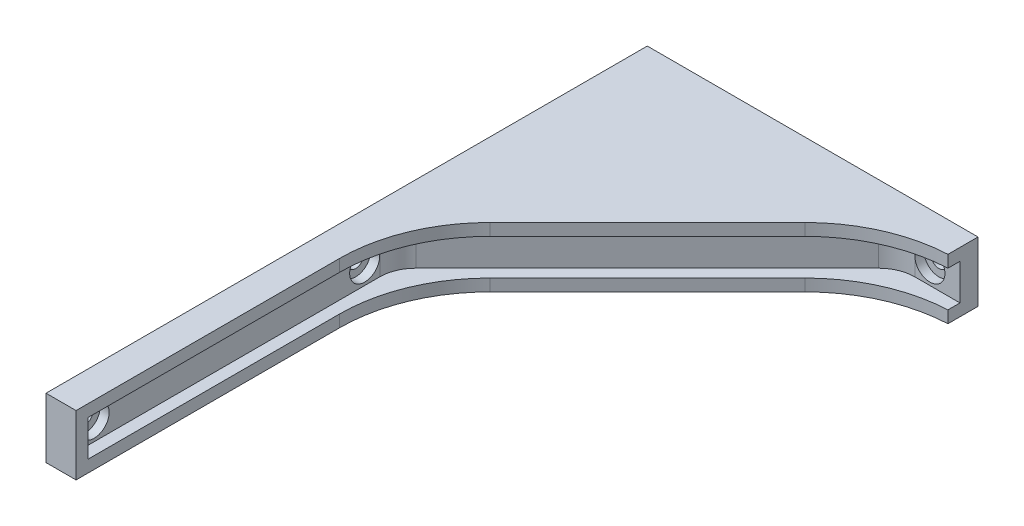
ISO-10303-21;
HEADER;
FILE_DESCRIPTION(('STEP AP214'),'2;1');
FILE_NAME('part.step','',(''),(''),'','','');
FILE_SCHEMA(('AUTOMOTIVE_DESIGN { 1 0 10303 214 1 1 1 1 }'));
ENDSEC;
DATA;
#1=APPLICATION_CONTEXT('core data for automotive mechanical design processes');
#2=APPLICATION_PROTOCOL_DEFINITION('international standard','automotive_design',2000,#1);
#3=PRODUCT_CONTEXT('',#1,'mechanical');
#4=PRODUCT('Part','Part','',(#3));
#5=PRODUCT_RELATED_PRODUCT_CATEGORY('part','',(#4));
#6=PRODUCT_DEFINITION_FORMATION('','',#4);
#7=PRODUCT_DEFINITION_CONTEXT('part definition',#1,'design');
#8=PRODUCT_DEFINITION('design','',#6,#7);
#9=PRODUCT_DEFINITION_SHAPE('','',#8);
#10=(LENGTH_UNIT() NAMED_UNIT(*) SI_UNIT(.MILLI.,.METRE.));
#11=(NAMED_UNIT(*) PLANE_ANGLE_UNIT() SI_UNIT($,.RADIAN.));
#12=(NAMED_UNIT(*) SI_UNIT($,.STERADIAN.) SOLID_ANGLE_UNIT());
#13=UNCERTAINTY_MEASURE_WITH_UNIT(LENGTH_MEASURE(1.E-05),#10,'distance_accuracy_value','');
#14=(GEOMETRIC_REPRESENTATION_CONTEXT(3) GLOBAL_UNCERTAINTY_ASSIGNED_CONTEXT((#13)) GLOBAL_UNIT_ASSIGNED_CONTEXT((#10,
#11,#12)) REPRESENTATION_CONTEXT('',''));
#15=CARTESIAN_POINT('',(0.,0.,0.));
#16=DIRECTION('',(0.,0.,1.));
#17=DIRECTION('',(1.,0.,0.));
#18=AXIS2_PLACEMENT_3D('',#15,#16,#17);
#19=CARTESIAN_POINT('',(6.00000000000001,20.,110.));
#20=DIRECTION('',(-1.,0.,0.));
#21=DIRECTION('',(0.,0.,1.));
#22=AXIS2_PLACEMENT_3D('',#19,#20,#21);
#23=PLANE('',#22);
#24=CARTESIAN_POINT('',(6.00000000000001,10.,100.));
#25=DIRECTION('',(1.,0.,0.));
#26=DIRECTION('',(0.,0.,-1.));
#27=AXIS2_PLACEMENT_3D('',#24,#25,#26);
#28=CIRCLE('',#27,5.);
#29=CARTESIAN_POINT('',(6.00000000000001,10.,95.));
#30=VERTEX_POINT('',#29);
#31=EDGE_CURVE('E280',#30,#30,#28,.T.);
#32=ORIENTED_EDGE('',*,*,#31,.F.);
#33=EDGE_LOOP('',(#32));
#34=FACE_BOUND('',#33,.T.);
#35=CARTESIAN_POINT('',(6.00000000000001,10.,190.));
#36=DIRECTION('',(1.,0.,0.));
#37=DIRECTION('',(0.,0.,-1.));
#38=AXIS2_PLACEMENT_3D('',#35,#36,#37);
#39=CIRCLE('',#38,4.99999999999999);
#40=CARTESIAN_POINT('',(6.00000000000001,10.,185.));
#41=VERTEX_POINT('',#40);
#42=EDGE_CURVE('E244',#41,#41,#39,.T.);
#43=ORIENTED_EDGE('',*,*,#42,.F.);
#44=EDGE_LOOP('',(#43));
#45=FACE_BOUND('',#44,.T.);
#46=DIRECTION('',(0.,1.,0.));
#47=VECTOR('',#46,1.);
#48=CARTESIAN_POINT('',(6.00000000000001,16.,196.));
#49=LINE('',#48,#47);
#50=CARTESIAN_POINT('',(6.00000000000001,4.,196.));
#51=VERTEX_POINT('',#50);
#52=CARTESIAN_POINT('',(6.00000000000001,16.,196.));
#53=VERTEX_POINT('',#52);
#54=EDGE_CURVE('E177',#51,#53,#49,.T.);
#55=ORIENTED_EDGE('',*,*,#54,.F.);
#56=DIRECTION('',(0.,0.,1.));
#57=VECTOR('',#56,1.);
#58=CARTESIAN_POINT('',(6.00000000000001,4.,200.));
#59=LINE('',#58,#57);
#60=CARTESIAN_POINT('',(6.00000000000001,4.,94.9705627484771));
#61=VERTEX_POINT('',#60);
#62=EDGE_CURVE('E185',#61,#51,#59,.T.);
#63=ORIENTED_EDGE('',*,*,#62,.F.);
#64=DIRECTION('',(0.,-1.,0.));
#65=VECTOR('',#64,1.);
#66=CARTESIAN_POINT('',(6.00000000000001,16.,94.9705627484771));
#67=LINE('',#66,#65);
#68=CARTESIAN_POINT('',(6.00000000000001,16.,94.9705627484771));
#69=VERTEX_POINT('',#68);
#70=EDGE_CURVE('E352',#61,#69,#67,.F.);
#71=ORIENTED_EDGE('',*,*,#70,.T.);
#72=DIRECTION('',(0.,0.,-1.));
#73=VECTOR('',#72,1.);
#74=CARTESIAN_POINT('',(6.00000000000001,16.,200.));
#75=LINE('',#74,#73);
#76=EDGE_CURVE('E195',#53,#69,#75,.T.);
#77=ORIENTED_EDGE('',*,*,#76,.F.);
#78=EDGE_LOOP('',(#55,#63,#71,#77));
#79=FACE_BOUND('',#78,.T.);
#80=ADVANCED_FACE('F39',(#34,#45,#79),#23,.F.);
#81=CARTESIAN_POINT('',(92.8284271247462,16.,8.82842712474619));
#82=DIRECTION('',(0.,1.,0.));
#83=DIRECTION('',(0.,0.,1.));
#84=AXIS2_PLACEMENT_3D('',#81,#82,#83);
#85=PLANE('',#84);
#86=DIRECTION('',(-1.,0.,0.));
#87=VECTOR('',#86,1.);
#88=CARTESIAN_POINT('',(10.,16.,196.));
#89=LINE('',#88,#87);
#90=CARTESIAN_POINT('',(10.,16.,196.));
#91=VERTEX_POINT('',#90);
#92=EDGE_CURVE('E174',#91,#53,#89,.T.);
#93=ORIENTED_EDGE('',*,*,#92,.T.);
#94=ORIENTED_EDGE('',*,*,#76,.T.);
#95=CARTESIAN_POINT('',(18.,16.,94.9705627484771));
#96=DIRECTION('',(0.,1.,0.));
#97=DIRECTION('',(0.,0.,1.));
#98=AXIS2_PLACEMENT_3D('',#95,#96,#97);
#99=CIRCLE('',#98,12.);
#100=CARTESIAN_POINT('',(9.51471862576146,16.,86.4852813742386));
#101=VERTEX_POINT('',#100);
#102=EDGE_CURVE('E346',#69,#101,#99,.F.);
#103=ORIENTED_EDGE('',*,*,#102,.T.);
#104=DIRECTION('',(0.707106781186547,0.,-0.707106781186548));
#105=VECTOR('',#104,1.);
#106=CARTESIAN_POINT('',(90.,16.,6.));
#107=LINE('',#106,#105);
#108=CARTESIAN_POINT('',(86.4852813742386,16.,9.51471862576143));
#109=VERTEX_POINT('',#108);
#110=EDGE_CURVE('E224',#101,#109,#107,.T.);
#111=ORIENTED_EDGE('',*,*,#110,.T.);
#112=CARTESIAN_POINT('',(94.9705627484771,16.,18.));
#113=DIRECTION('',(0.,1.,0.));
#114=DIRECTION('',(0.,0.,1.));
#115=AXIS2_PLACEMENT_3D('',#112,#113,#114);
#116=CIRCLE('',#115,12.);
#117=CARTESIAN_POINT('',(94.9705627484771,16.,6.00000000000001));
#118=VERTEX_POINT('',#117);
#119=EDGE_CURVE('E349',#109,#118,#116,.F.);
#120=ORIENTED_EDGE('',*,*,#119,.T.);
#121=DIRECTION('',(1.,0.,0.));
#122=VECTOR('',#121,1.);
#123=CARTESIAN_POINT('',(90.,16.,6.00000000000001));
#124=LINE('',#123,#122);
#125=CARTESIAN_POINT('',(110.,16.,6.));
#126=VERTEX_POINT('',#125);
#127=EDGE_CURVE('E452',#118,#126,#124,.T.);
#128=ORIENTED_EDGE('',*,*,#127,.T.);
#129=DIRECTION('',(0.,0.,-1.));
#130=VECTOR('',#129,1.);
#131=CARTESIAN_POINT('',(110.,16.,10.));
#132=LINE('',#131,#130);
#133=CARTESIAN_POINT('',(110.,16.,10.));
#134=VERTEX_POINT('',#133);
#135=EDGE_CURVE('E207',#134,#126,#132,.T.);
#136=ORIENTED_EDGE('',*,*,#135,.F.);
#137=CARTESIAN_POINT('',(112.426443346309,16.,59.9410890218381));
#138=DIRECTION('',(0.,1.,0.));
#139=DIRECTION('',(0.,0.,1.));
#140=AXIS2_PLACEMENT_3D('',#137,#138,#139);
#141=CIRCLE('',#140,50.);
#142=CARTESIAN_POINT('',(77.0711042869817,16.,24.5857499625107));
#143=VERTEX_POINT('',#142);
#144=EDGE_CURVE('E48',#134,#143,#141,.T.);
#145=ORIENTED_EDGE('',*,*,#144,.T.);
#146=DIRECTION('',(0.707106781186547,0.,-0.707106781186548));
#147=VECTOR('',#146,1.);
#148=CARTESIAN_POINT('',(92.8284271247462,16.,8.82842712474619));
#149=LINE('',#148,#147);
#150=CARTESIAN_POINT('',(24.6446609406727,16.,77.0121933088197));
#151=VERTEX_POINT('',#150);
#152=EDGE_CURVE('E232',#151,#143,#149,.T.);
#153=ORIENTED_EDGE('',*,*,#152,.F.);
#154=CARTESIAN_POINT('',(60.,16.,112.367532368147));
#155=DIRECTION('',(0.,1.,0.));
#156=DIRECTION('',(0.,0.,1.));
#157=AXIS2_PLACEMENT_3D('',#154,#155,#156);
#158=CIRCLE('',#157,50.);
#159=CARTESIAN_POINT('',(10.,16.,112.367532368147));
#160=VERTEX_POINT('',#159);
#161=EDGE_CURVE('E380',#151,#160,#158,.T.);
#162=ORIENTED_EDGE('',*,*,#161,.T.);
#163=DIRECTION('',(0.,0.,-1.));
#164=VECTOR('',#163,1.);
#165=CARTESIAN_POINT('',(10.,16.,200.));
#166=LINE('',#165,#164);
#167=EDGE_CURVE('E55',#91,#160,#166,.T.);
#168=ORIENTED_EDGE('',*,*,#167,.F.);
#169=EDGE_LOOP('',(#93,#94,#103,#111,#120,#128,#136,#145,#153,#162,#168));
#170=FACE_BOUND('',#169,.T.);
#171=ADVANCED_FACE('F395',(#170),#85,.F.);
#172=CARTESIAN_POINT('',(8.82842712474622,4.,92.8284271247462));
#173=DIRECTION('',(0.,-1.,0.));
#174=DIRECTION('',(0.,0.,-1.));
#175=AXIS2_PLACEMENT_3D('',#172,#173,#174);
#176=PLANE('',#175);
#177=DIRECTION('',(-1.,0.,0.));
#178=VECTOR('',#177,1.);
#179=CARTESIAN_POINT('',(10.,4.,196.));
#180=LINE('',#179,#178);
#181=CARTESIAN_POINT('',(10.,4.,196.));
#182=VERTEX_POINT('',#181);
#183=EDGE_CURVE('E171',#182,#51,#180,.T.);
#184=ORIENTED_EDGE('',*,*,#183,.F.);
#185=DIRECTION('',(0.,0.,1.));
#186=VECTOR('',#185,1.);
#187=CARTESIAN_POINT('',(10.,4.,200.));
#188=LINE('',#187,#186);
#189=CARTESIAN_POINT('',(10.,4.,112.367532368147));
#190=VERTEX_POINT('',#189);
#191=EDGE_CURVE('E183',#190,#182,#188,.T.);
#192=ORIENTED_EDGE('',*,*,#191,.F.);
#193=CARTESIAN_POINT('',(60.,4.,112.367532368147));
#194=DIRECTION('',(0.,-1.,0.));
#195=DIRECTION('',(0.,0.,-1.));
#196=AXIS2_PLACEMENT_3D('',#193,#194,#195);
#197=CIRCLE('',#196,50.);
#198=CARTESIAN_POINT('',(24.6446609406726,4.,77.0121933088198));
#199=VERTEX_POINT('',#198);
#200=EDGE_CURVE('E374',#190,#199,#197,.T.);
#201=ORIENTED_EDGE('',*,*,#200,.T.);
#202=DIRECTION('',(-0.707106781186547,0.,0.707106781186548));
#203=VECTOR('',#202,1.);
#204=CARTESIAN_POINT('',(8.82842712474622,4.,92.8284271247462));
#205=LINE('',#204,#203);
#206=CARTESIAN_POINT('',(77.0711042869817,4.,24.5857499625107));
#207=VERTEX_POINT('',#206);
#208=EDGE_CURVE('E220',#207,#199,#205,.T.);
#209=ORIENTED_EDGE('',*,*,#208,.F.);
#210=CARTESIAN_POINT('',(112.426443346309,4.,59.9410890218381));
#211=DIRECTION('',(0.,-1.,0.));
#212=DIRECTION('',(0.,0.,-1.));
#213=AXIS2_PLACEMENT_3D('',#210,#211,#212);
#214=CIRCLE('',#213,50.);
#215=CARTESIAN_POINT('',(110.,4.,10.));
#216=VERTEX_POINT('',#215);
#217=EDGE_CURVE('E386',#207,#216,#214,.T.);
#218=ORIENTED_EDGE('',*,*,#217,.T.);
#219=DIRECTION('',(0.,0.,-1.));
#220=VECTOR('',#219,1.);
#221=CARTESIAN_POINT('',(110.,4.,10.));
#222=LINE('',#221,#220);
#223=CARTESIAN_POINT('',(110.,4.,6.00000000000001));
#224=VERTEX_POINT('',#223);
#225=EDGE_CURVE('E448',#216,#224,#222,.T.);
#226=ORIENTED_EDGE('',*,*,#225,.T.);
#227=DIRECTION('',(-1.,0.,0.));
#228=VECTOR('',#227,1.);
#229=CARTESIAN_POINT('',(90.,4.,6.00000000000001));
#230=LINE('',#229,#228);
#231=CARTESIAN_POINT('',(94.9705627484771,4.,6.00000000000001));
#232=VERTEX_POINT('',#231);
#233=EDGE_CURVE('E187',#224,#232,#230,.T.);
#234=ORIENTED_EDGE('',*,*,#233,.T.);
#235=CARTESIAN_POINT('',(94.9705627484771,4.,18.));
#236=DIRECTION('',(0.,-1.,0.));
#237=DIRECTION('',(0.,0.,-1.));
#238=AXIS2_PLACEMENT_3D('',#235,#236,#237);
#239=CIRCLE('',#238,12.);
#240=CARTESIAN_POINT('',(86.4852813742386,4.,9.51471862576145));
#241=VERTEX_POINT('',#240);
#242=EDGE_CURVE('E336',#232,#241,#239,.F.);
#243=ORIENTED_EDGE('',*,*,#242,.T.);
#244=DIRECTION('',(-0.707106781186547,0.,0.707106781186548));
#245=VECTOR('',#244,1.);
#246=CARTESIAN_POINT('',(6.00000000000003,4.,90.));
#247=LINE('',#246,#245);
#248=CARTESIAN_POINT('',(9.51471862576145,4.,86.4852813742386));
#249=VERTEX_POINT('',#248);
#250=EDGE_CURVE('E214',#241,#249,#247,.T.);
#251=ORIENTED_EDGE('',*,*,#250,.T.);
#252=CARTESIAN_POINT('',(18.,4.,94.9705627484771));
#253=DIRECTION('',(0.,-1.,0.));
#254=DIRECTION('',(0.,0.,-1.));
#255=AXIS2_PLACEMENT_3D('',#252,#253,#254);
#256=CIRCLE('',#255,12.);
#257=EDGE_CURVE('E333',#249,#61,#256,.F.);
#258=ORIENTED_EDGE('',*,*,#257,.T.);
#259=ORIENTED_EDGE('',*,*,#62,.T.);
#260=EDGE_LOOP('',(#184,#192,#201,#209,#218,#226,#234,#243,#251,#258,#259));
#261=FACE_BOUND('',#260,.T.);
#262=ADVANCED_FACE('F182',(#261),#176,.F.);
#263=CARTESIAN_POINT('',(110.,20.,6.));
#264=DIRECTION('',(0.,0.,-1.));
#265=DIRECTION('',(-1.,0.,0.));
#266=AXIS2_PLACEMENT_3D('',#263,#264,#265);
#267=PLANE('',#266);
#268=CARTESIAN_POINT('',(100.,10.,6.00000000000001));
#269=DIRECTION('',(0.,0.,1.));
#270=DIRECTION('',(1.,0.,0.));
#271=AXIS2_PLACEMENT_3D('',#268,#269,#270);
#272=CIRCLE('',#271,5.);
#273=CARTESIAN_POINT('',(105.,10.,6.00000000000001));
#274=VERTEX_POINT('',#273);
#275=EDGE_CURVE('E264',#274,#274,#272,.T.);
#276=ORIENTED_EDGE('',*,*,#275,.F.);
#277=EDGE_LOOP('',(#276));
#278=FACE_BOUND('',#277,.T.);
#279=ORIENTED_EDGE('',*,*,#127,.F.);
#280=DIRECTION('',(0.,-1.,0.));
#281=VECTOR('',#280,1.);
#282=CARTESIAN_POINT('',(94.9705627484771,4.,6.));
#283=LINE('',#282,#281);
#284=EDGE_CURVE('E323',#118,#232,#283,.T.);
#285=ORIENTED_EDGE('',*,*,#284,.T.);
#286=ORIENTED_EDGE('',*,*,#233,.F.);
#287=DIRECTION('',(0.,-1.,0.));
#288=VECTOR('',#287,1.);
#289=CARTESIAN_POINT('',(110.,20.,6.));
#290=LINE('',#289,#288);
#291=EDGE_CURVE('E319',#126,#224,#290,.T.);
#292=ORIENTED_EDGE('',*,*,#291,.F.);
#293=EDGE_LOOP('',(#279,#285,#286,#292));
#294=FACE_BOUND('',#293,.T.);
#295=ADVANCED_FACE('F485',(#278,#294),#267,.F.);
#296=CARTESIAN_POINT('',(50.8284271247462,0.,50.8284271247462));
#297=DIRECTION('',(-0.707106781186548,0.,-0.707106781186547));
#298=DIRECTION('',(-0.707106781186547,0.,0.707106781186548));
#299=AXIS2_PLACEMENT_3D('',#296,#297,#298);
#300=PLANE('',#299);
#301=DIRECTION('',(-0.707106781186547,0.,0.707106781186548));
#302=VECTOR('',#301,1.);
#303=CARTESIAN_POINT('',(92.8284271247462,20.,8.82842712474619));
#304=LINE('',#303,#302);
#305=CARTESIAN_POINT('',(77.0711042869817,20.,24.5857499625107));
#306=VERTEX_POINT('',#305);
#307=CARTESIAN_POINT('',(24.6446609406727,20.,77.0121933088197));
#308=VERTEX_POINT('',#307);
#309=EDGE_CURVE('E228',#306,#308,#304,.T.);
#310=ORIENTED_EDGE('',*,*,#309,.T.);
#311=DIRECTION('',(0.,-1.,0.));
#312=VECTOR('',#311,1.);
#313=CARTESIAN_POINT('',(24.6446609406726,0.,77.0121933088198));
#314=LINE('',#313,#312);
#315=EDGE_CURVE('E368',#308,#151,#314,.T.);
#316=ORIENTED_EDGE('',*,*,#315,.T.);
#317=ORIENTED_EDGE('',*,*,#152,.T.);
#318=DIRECTION('',(0.,1.,0.));
#319=VECTOR('',#318,1.);
#320=CARTESIAN_POINT('',(77.0711042869817,0.,24.5857499625107));
#321=LINE('',#320,#319);
#322=EDGE_CURVE('E365',#143,#306,#321,.T.);
#323=ORIENTED_EDGE('',*,*,#322,.T.);
#324=EDGE_LOOP('',(#310,#316,#317,#323));
#325=FACE_BOUND('',#324,.T.);
#326=ADVANCED_FACE('F402',(#325),#300,.F.);
#327=CARTESIAN_POINT('',(50.8284271247462,0.,50.8284271247462));
#328=DIRECTION('',(-0.707106781186548,0.,-0.707106781186547));
#329=DIRECTION('',(-0.707106781186547,0.,0.707106781186548));
#330=AXIS2_PLACEMENT_3D('',#327,#328,#329);
#331=PLANE('',#330);
#332=ORIENTED_EDGE('',*,*,#208,.T.);
#333=DIRECTION('',(0.,1.,0.));
#334=VECTOR('',#333,1.);
#335=CARTESIAN_POINT('',(24.6446609406726,0.,77.0121933088198));
#336=LINE('',#335,#334);
#337=CARTESIAN_POINT('',(24.6446609406726,0.,77.0121933088198));
#338=VERTEX_POINT('',#337);
#339=EDGE_CURVE('E362',#199,#338,#336,.F.);
#340=ORIENTED_EDGE('',*,*,#339,.T.);
#341=DIRECTION('',(0.707106781186547,0.,-0.707106781186548));
#342=VECTOR('',#341,1.);
#343=CARTESIAN_POINT('',(8.82842712474622,0.,92.8284271247462));
#344=LINE('',#343,#342);
#345=CARTESIAN_POINT('',(77.0711042869817,0.,24.5857499625107));
#346=VERTEX_POINT('',#345);
#347=EDGE_CURVE('E216',#338,#346,#344,.T.);
#348=ORIENTED_EDGE('',*,*,#347,.T.);
#349=DIRECTION('',(0.,-1.,0.));
#350=VECTOR('',#349,1.);
#351=CARTESIAN_POINT('',(77.0711042869817,0.,24.5857499625107));
#352=LINE('',#351,#350);
#353=EDGE_CURVE('E358',#346,#207,#352,.F.);
#354=ORIENTED_EDGE('',*,*,#353,.T.);
#355=EDGE_LOOP('',(#332,#340,#348,#354));
#356=FACE_BOUND('',#355,.T.);
#357=ADVANCED_FACE('F439',(#356),#331,.F.);
#358=CARTESIAN_POINT('',(6.00000000000001,20.,90.));
#359=DIRECTION('',(-0.707106781186548,0.,-0.707106781186547));
#360=DIRECTION('',(-0.707106781186547,0.,0.707106781186548));
#361=AXIS2_PLACEMENT_3D('',#358,#359,#360);
#362=PLANE('',#361);
#363=ORIENTED_EDGE('',*,*,#250,.F.);
#364=DIRECTION('',(0.,-1.,0.));
#365=VECTOR('',#364,1.);
#366=CARTESIAN_POINT('',(86.4852813742386,16.,9.51471862576144));
#367=LINE('',#366,#365);
#368=EDGE_CURVE('E343',#241,#109,#367,.F.);
#369=ORIENTED_EDGE('',*,*,#368,.T.);
#370=ORIENTED_EDGE('',*,*,#110,.F.);
#371=DIRECTION('',(0.,-1.,0.));
#372=VECTOR('',#371,1.);
#373=CARTESIAN_POINT('',(9.51471862576144,4.,86.4852813742386));
#374=LINE('',#373,#372);
#375=EDGE_CURVE('E339',#101,#249,#374,.T.);
#376=ORIENTED_EDGE('',*,*,#375,.T.);
#377=EDGE_LOOP('',(#363,#369,#370,#376));
#378=FACE_BOUND('',#377,.T.);
#379=ADVANCED_FACE('F478',(#378),#362,.F.);
#380=CARTESIAN_POINT('',(100.,10.,0.));
#381=DIRECTION('',(0.,0.,1.));
#382=DIRECTION('',(1.,0.,0.));
#383=AXIS2_PLACEMENT_3D('',#380,#381,#382);
#384=CYLINDRICAL_SURFACE('',#383,2.6);
#385=CARTESIAN_POINT('',(100.,10.,0.));
#386=DIRECTION('',(0.,0.,1.));
#387=DIRECTION('',(1.,0.,0.));
#388=AXIS2_PLACEMENT_3D('',#385,#386,#387);
#389=CIRCLE('',#388,2.6);
#390=CARTESIAN_POINT('',(102.6,10.,0.));
#391=VERTEX_POINT('',#390);
#392=EDGE_CURVE('E276',#391,#391,#389,.T.);
#393=ORIENTED_EDGE('',*,*,#392,.F.);
#394=EDGE_LOOP('',(#393));
#395=FACE_BOUND('',#394,.T.);
#396=CARTESIAN_POINT('',(100.,10.,3.00000000000001));
#397=DIRECTION('',(0.,0.,1.));
#398=DIRECTION('',(1.,0.,0.));
#399=AXIS2_PLACEMENT_3D('',#396,#397,#398);
#400=CIRCLE('',#399,2.6);
#401=CARTESIAN_POINT('',(102.6,10.,3.00000000000001));
#402=VERTEX_POINT('',#401);
#403=EDGE_CURVE('E272',#402,#402,#400,.F.);
#404=ORIENTED_EDGE('',*,*,#403,.F.);
#405=EDGE_LOOP('',(#404));
#406=FACE_BOUND('',#405,.T.);
#407=ADVANCED_FACE('F559',(#395,#406),#384,.F.);
#408=CARTESIAN_POINT('',(-14.,10.,100.));
#409=DIRECTION('',(1.,0.,0.));
#410=DIRECTION('',(0.,0.,-1.));
#411=AXIS2_PLACEMENT_3D('',#408,#409,#410);
#412=CYLINDRICAL_SURFACE('',#411,2.6);
#413=CARTESIAN_POINT('',(0.,10.,100.));
#414=DIRECTION('',(1.,0.,0.));
#415=DIRECTION('',(0.,0.,-1.));
#416=AXIS2_PLACEMENT_3D('',#413,#414,#415);
#417=CIRCLE('',#416,2.6);
#418=CARTESIAN_POINT('',(0.,10.,97.4));
#419=VERTEX_POINT('',#418);
#420=EDGE_CURVE('E289',#419,#419,#417,.T.);
#421=ORIENTED_EDGE('',*,*,#420,.F.);
#422=EDGE_LOOP('',(#421));
#423=FACE_BOUND('',#422,.T.);
#424=CARTESIAN_POINT('',(3.00000000000001,10.,100.));
#425=DIRECTION('',(1.,0.,0.));
#426=DIRECTION('',(0.,0.,-1.));
#427=AXIS2_PLACEMENT_3D('',#424,#425,#426);
#428=CIRCLE('',#427,2.6);
#429=CARTESIAN_POINT('',(3.00000000000001,10.,97.4));
#430=VERTEX_POINT('',#429);
#431=EDGE_CURVE('E285',#430,#430,#428,.F.);
#432=ORIENTED_EDGE('',*,*,#431,.F.);
#433=EDGE_LOOP('',(#432));
#434=FACE_BOUND('',#433,.T.);
#435=ADVANCED_FACE('F510',(#423,#434),#412,.F.);
#436=CARTESIAN_POINT('',(0.,20.,0.));
#437=DIRECTION('',(1.,0.,0.));
#438=DIRECTION('',(0.,0.,-1.));
#439=AXIS2_PLACEMENT_3D('',#436,#437,#438);
#440=PLANE('',#439);
#441=CARTESIAN_POINT('',(0.,10.,190.));
#442=DIRECTION('',(1.,0.,0.));
#443=DIRECTION('',(0.,0.,-1.));
#444=AXIS2_PLACEMENT_3D('',#441,#442,#443);
#445=CIRCLE('',#444,2.59999999999999);
#446=CARTESIAN_POINT('',(0.,10.,187.4));
#447=VERTEX_POINT('',#446);
#448=EDGE_CURVE('E240',#447,#447,#445,.T.);
#449=ORIENTED_EDGE('',*,*,#448,.T.);
#450=EDGE_LOOP('',(#449));
#451=FACE_BOUND('',#450,.T.);
#452=ORIENTED_EDGE('',*,*,#420,.T.);
#453=EDGE_LOOP('',(#452));
#454=FACE_BOUND('',#453,.T.);
#455=DIRECTION('',(0.,0.,1.));
#456=VECTOR('',#455,1.);
#457=CARTESIAN_POINT('',(0.,0.,0.));
#458=LINE('',#457,#456);
#459=CARTESIAN_POINT('',(0.,0.,0.));
#460=VERTEX_POINT('',#459);
#461=CARTESIAN_POINT('',(0.,0.,200.));
#462=VERTEX_POINT('',#461);
#463=EDGE_CURVE('E293',#460,#462,#458,.T.);
#464=ORIENTED_EDGE('',*,*,#463,.T.);
#465=DIRECTION('',(0.,1.,0.));
#466=VECTOR('',#465,1.);
#467=CARTESIAN_POINT('',(0.,0.,200.));
#468=LINE('',#467,#466);
#469=CARTESIAN_POINT('',(0.,20.,200.));
#470=VERTEX_POINT('',#469);
#471=EDGE_CURVE('E252',#462,#470,#468,.T.);
#472=ORIENTED_EDGE('',*,*,#471,.T.);
#473=DIRECTION('',(0.,0.,1.));
#474=VECTOR('',#473,1.);
#475=CARTESIAN_POINT('',(0.,20.,0.));
#476=LINE('',#475,#474);
#477=CARTESIAN_POINT('',(0.,20.,0.));
#478=VERTEX_POINT('',#477);
#479=EDGE_CURVE('E294',#478,#470,#476,.T.);
#480=ORIENTED_EDGE('',*,*,#479,.F.);
#481=DIRECTION('',(0.,-1.,0.));
#482=VECTOR('',#481,1.);
#483=CARTESIAN_POINT('',(0.,20.,0.));
#484=LINE('',#483,#482);
#485=EDGE_CURVE('E304',#478,#460,#484,.T.);
#486=ORIENTED_EDGE('',*,*,#485,.T.);
#487=EDGE_LOOP('',(#464,#472,#480,#486));
#488=FACE_BOUND('',#487,.T.);
#489=ADVANCED_FACE('F427',(#451,#454,#488),#440,.F.);
#490=CARTESIAN_POINT('',(110.,20.,0.));
#491=DIRECTION('',(-1.,0.,0.));
#492=DIRECTION('',(0.,0.,1.));
#493=AXIS2_PLACEMENT_3D('',#490,#491,#492);
#494=PLANE('',#493);
#495=DIRECTION('',(0.,0.,-1.));
#496=VECTOR('',#495,1.);
#497=CARTESIAN_POINT('',(110.,0.,0.));
#498=LINE('',#497,#496);
#499=CARTESIAN_POINT('',(110.,0.,10.));
#500=VERTEX_POINT('',#499);
#501=CARTESIAN_POINT('',(110.,0.,0.));
#502=VERTEX_POINT('',#501);
#503=EDGE_CURVE('E307',#500,#502,#498,.T.);
#504=ORIENTED_EDGE('',*,*,#503,.T.);
#505=DIRECTION('',(0.,-1.,0.));
#506=VECTOR('',#505,1.);
#507=CARTESIAN_POINT('',(110.,20.,0.));
#508=LINE('',#507,#506);
#509=CARTESIAN_POINT('',(110.,20.,0.));
#510=VERTEX_POINT('',#509);
#511=EDGE_CURVE('E315',#510,#502,#508,.T.);
#512=ORIENTED_EDGE('',*,*,#511,.F.);
#513=DIRECTION('',(0.,0.,-1.));
#514=VECTOR('',#513,1.);
#515=CARTESIAN_POINT('',(110.,20.,0.));
#516=LINE('',#515,#514);
#517=CARTESIAN_POINT('',(110.,20.,10.));
#518=VERTEX_POINT('',#517);
#519=EDGE_CURVE('E297',#518,#510,#516,.T.);
#520=ORIENTED_EDGE('',*,*,#519,.F.);
#521=DIRECTION('',(0.,1.,0.));
#522=VECTOR('',#521,1.);
#523=CARTESIAN_POINT('',(110.,16.,10.));
#524=LINE('',#523,#522);
#525=EDGE_CURVE('E406',#134,#518,#524,.T.);
#526=ORIENTED_EDGE('',*,*,#525,.F.);
#527=ORIENTED_EDGE('',*,*,#135,.T.);
#528=ORIENTED_EDGE('',*,*,#291,.T.);
#529=ORIENTED_EDGE('',*,*,#225,.F.);
#530=DIRECTION('',(0.,1.,0.));
#531=VECTOR('',#530,1.);
#532=CARTESIAN_POINT('',(110.,4.,10.));
#533=LINE('',#532,#531);
#534=EDGE_CURVE('E445',#500,#216,#533,.T.);
#535=ORIENTED_EDGE('',*,*,#534,.F.);
#536=EDGE_LOOP('',(#504,#512,#520,#526,#527,#528,#529,#535));
#537=FACE_BOUND('',#536,.T.);
#538=ADVANCED_FACE('F412',(#537),#494,.F.);
#539=CARTESIAN_POINT('',(0.,20.,0.));
#540=DIRECTION('',(0.,0.,1.));
#541=DIRECTION('',(1.,0.,0.));
#542=AXIS2_PLACEMENT_3D('',#539,#540,#541);
#543=PLANE('',#542);
#544=ORIENTED_EDGE('',*,*,#392,.T.);
#545=EDGE_LOOP('',(#544));
#546=FACE_BOUND('',#545,.T.);
#547=DIRECTION('',(-1.,0.,0.));
#548=VECTOR('',#547,1.);
#549=CARTESIAN_POINT('',(0.,0.,0.));
#550=LINE('',#549,#548);
#551=EDGE_CURVE('E298',#502,#460,#550,.T.);
#552=ORIENTED_EDGE('',*,*,#551,.T.);
#553=ORIENTED_EDGE('',*,*,#485,.F.);
#554=DIRECTION('',(-1.,0.,0.));
#555=VECTOR('',#554,1.);
#556=CARTESIAN_POINT('',(0.,20.,0.));
#557=LINE('',#556,#555);
#558=EDGE_CURVE('E301',#510,#478,#557,.T.);
#559=ORIENTED_EDGE('',*,*,#558,.F.);
#560=ORIENTED_EDGE('',*,*,#511,.T.);
#561=EDGE_LOOP('',(#552,#553,#559,#560));
#562=FACE_BOUND('',#561,.T.);
#563=ADVANCED_FACE('F418',(#546,#562),#543,.F.);
#564=CARTESIAN_POINT('',(0.,20.,0.));
#565=DIRECTION('',(0.,1.,0.));
#566=DIRECTION('',(0.,0.,1.));
#567=AXIS2_PLACEMENT_3D('',#564,#565,#566);
#568=PLANE('',#567);
#569=ORIENTED_EDGE('',*,*,#309,.F.);
#570=CARTESIAN_POINT('',(112.426443346309,20.,59.9410890218381));
#571=DIRECTION('',(0.,1.,0.));
#572=DIRECTION('',(0.,0.,1.));
#573=AXIS2_PLACEMENT_3D('',#570,#571,#572);
#574=CIRCLE('',#573,50.);
#575=EDGE_CURVE('E11',#306,#518,#574,.F.);
#576=ORIENTED_EDGE('',*,*,#575,.T.);
#577=ORIENTED_EDGE('',*,*,#519,.T.);
#578=ORIENTED_EDGE('',*,*,#558,.T.);
#579=ORIENTED_EDGE('',*,*,#479,.T.);
#580=DIRECTION('',(-1.,0.,0.));
#581=VECTOR('',#580,1.);
#582=CARTESIAN_POINT('',(6.00000000000002,20.,200.));
#583=LINE('',#582,#581);
#584=CARTESIAN_POINT('',(10.,20.,200.));
#585=VERTEX_POINT('',#584);
#586=EDGE_CURVE('E260',#585,#470,#583,.T.);
#587=ORIENTED_EDGE('',*,*,#586,.F.);
#588=DIRECTION('',(0.,0.,1.));
#589=VECTOR('',#588,1.);
#590=CARTESIAN_POINT('',(10.,20.,200.));
#591=LINE('',#590,#589);
#592=CARTESIAN_POINT('',(10.,20.,112.367532368147));
#593=VERTEX_POINT('',#592);
#594=EDGE_CURVE('E212',#593,#585,#591,.T.);
#595=ORIENTED_EDGE('',*,*,#594,.F.);
#596=CARTESIAN_POINT('',(60.,20.,112.367532368147));
#597=DIRECTION('',(0.,1.,0.));
#598=DIRECTION('',(0.,0.,1.));
#599=AXIS2_PLACEMENT_3D('',#596,#597,#598);
#600=CIRCLE('',#599,50.);
#601=EDGE_CURVE('E383',#593,#308,#600,.F.);
#602=ORIENTED_EDGE('',*,*,#601,.T.);
#603=EDGE_LOOP('',(#569,#576,#577,#578,#579,#587,#595,#602));
#604=FACE_BOUND('',#603,.T.);
#605=ADVANCED_FACE('F409',(#604),#568,.T.);
#606=CARTESIAN_POINT('',(0.,0.,0.));
#607=DIRECTION('',(0.,1.,0.));
#608=DIRECTION('',(0.,0.,1.));
#609=AXIS2_PLACEMENT_3D('',#606,#607,#608);
#610=PLANE('',#609);
#611=ORIENTED_EDGE('',*,*,#503,.F.);
#612=CARTESIAN_POINT('',(112.426443346309,0.,59.9410890218381));
#613=DIRECTION('',(0.,1.,0.));
#614=DIRECTION('',(0.,0.,1.));
#615=AXIS2_PLACEMENT_3D('',#612,#613,#614);
#616=CIRCLE('',#615,50.);
#617=EDGE_CURVE('E389',#500,#346,#616,.T.);
#618=ORIENTED_EDGE('',*,*,#617,.T.);
#619=ORIENTED_EDGE('',*,*,#347,.F.);
#620=CARTESIAN_POINT('',(60.,0.,112.367532368147));
#621=DIRECTION('',(0.,1.,0.));
#622=DIRECTION('',(0.,0.,1.));
#623=AXIS2_PLACEMENT_3D('',#620,#621,#622);
#624=CIRCLE('',#623,50.);
#625=CARTESIAN_POINT('',(10.,0.,112.367532368147));
#626=VERTEX_POINT('',#625);
#627=EDGE_CURVE('E377',#338,#626,#624,.T.);
#628=ORIENTED_EDGE('',*,*,#627,.T.);
#629=DIRECTION('',(0.,0.,-1.));
#630=VECTOR('',#629,1.);
#631=CARTESIAN_POINT('',(10.,0.,200.));
#632=LINE('',#631,#630);
#633=CARTESIAN_POINT('',(10.,0.,200.));
#634=VERTEX_POINT('',#633);
#635=EDGE_CURVE('E196',#634,#626,#632,.T.);
#636=ORIENTED_EDGE('',*,*,#635,.F.);
#637=DIRECTION('',(-1.,0.,0.));
#638=VECTOR('',#637,1.);
#639=CARTESIAN_POINT('',(6.00000000000002,0.,200.));
#640=LINE('',#639,#638);
#641=EDGE_CURVE('E259',#634,#462,#640,.T.);
#642=ORIENTED_EDGE('',*,*,#641,.T.);
#643=ORIENTED_EDGE('',*,*,#463,.F.);
#644=ORIENTED_EDGE('',*,*,#551,.F.);
#645=EDGE_LOOP('',(#611,#618,#619,#628,#636,#642,#643,#644));
#646=FACE_BOUND('',#645,.T.);
#647=ADVANCED_FACE('F431',(#646),#610,.F.);
#648=CARTESIAN_POINT('',(3.00000000000001,10.,100.));
#649=DIRECTION('',(1.,0.,0.));
#650=DIRECTION('',(0.,0.,-1.));
#651=AXIS2_PLACEMENT_3D('',#648,#649,#650);
#652=PLANE('',#651);
#653=CARTESIAN_POINT('',(3.00000000000001,10.,100.));
#654=DIRECTION('',(1.,0.,0.));
#655=DIRECTION('',(0.,0.,-1.));
#656=AXIS2_PLACEMENT_3D('',#653,#654,#655);
#657=CIRCLE('',#656,5.);
#658=CARTESIAN_POINT('',(3.00000000000001,10.,95.));
#659=VERTEX_POINT('',#658);
#660=EDGE_CURVE('E281',#659,#659,#657,.T.);
#661=ORIENTED_EDGE('',*,*,#660,.T.);
#662=EDGE_LOOP('',(#661));
#663=FACE_BOUND('',#662,.T.);
#664=ORIENTED_EDGE('',*,*,#431,.T.);
#665=EDGE_LOOP('',(#664));
#666=FACE_BOUND('',#665,.T.);
#667=ADVANCED_FACE('F563',(#663,#666),#652,.T.);
#668=CARTESIAN_POINT('',(3.00000000000001,10.,100.));
#669=DIRECTION('',(1.,0.,0.));
#670=DIRECTION('',(0.,0.,-1.));
#671=AXIS2_PLACEMENT_3D('',#668,#669,#670);
#672=CYLINDRICAL_SURFACE('',#671,5.);
#673=ORIENTED_EDGE('',*,*,#660,.F.);
#674=EDGE_LOOP('',(#673));
#675=FACE_BOUND('',#674,.T.);
#676=ORIENTED_EDGE('',*,*,#31,.T.);
#677=EDGE_LOOP('',(#676));
#678=FACE_BOUND('',#677,.T.);
#679=ADVANCED_FACE('F554',(#675,#678),#672,.F.);
#680=CARTESIAN_POINT('',(100.,10.,3.00000000000001));
#681=DIRECTION('',(0.,0.,1.));
#682=DIRECTION('',(1.,0.,0.));
#683=AXIS2_PLACEMENT_3D('',#680,#681,#682);
#684=PLANE('',#683);
#685=CARTESIAN_POINT('',(100.,10.,3.00000000000001));
#686=DIRECTION('',(0.,0.,1.));
#687=DIRECTION('',(1.,0.,0.));
#688=AXIS2_PLACEMENT_3D('',#685,#686,#687);
#689=CIRCLE('',#688,5.);
#690=CARTESIAN_POINT('',(105.,10.,3.00000000000001));
#691=VERTEX_POINT('',#690);
#692=EDGE_CURVE('E268',#691,#691,#689,.T.);
#693=ORIENTED_EDGE('',*,*,#692,.T.);
#694=EDGE_LOOP('',(#693));
#695=FACE_BOUND('',#694,.T.);
#696=ORIENTED_EDGE('',*,*,#403,.T.);
#697=EDGE_LOOP('',(#696));
#698=FACE_BOUND('',#697,.T.);
#699=ADVANCED_FACE('F551',(#695,#698),#684,.T.);
#700=CARTESIAN_POINT('',(100.,10.,3.00000000000001));
#701=DIRECTION('',(0.,0.,1.));
#702=DIRECTION('',(1.,0.,0.));
#703=AXIS2_PLACEMENT_3D('',#700,#701,#702);
#704=CYLINDRICAL_SURFACE('',#703,5.);
#705=ORIENTED_EDGE('',*,*,#692,.F.);
#706=EDGE_LOOP('',(#705));
#707=FACE_BOUND('',#706,.T.);
#708=ORIENTED_EDGE('',*,*,#275,.T.);
#709=EDGE_LOOP('',(#708));
#710=FACE_BOUND('',#709,.T.);
#711=ADVANCED_FACE('F550',(#707,#710),#704,.F.);
#712=CARTESIAN_POINT('',(6.00000000000002,0.,200.));
#713=DIRECTION('',(0.,0.,1.));
#714=DIRECTION('',(1.,0.,0.));
#715=AXIS2_PLACEMENT_3D('',#712,#713,#714);
#716=PLANE('',#715);
#717=ORIENTED_EDGE('',*,*,#471,.F.);
#718=ORIENTED_EDGE('',*,*,#641,.F.);
#719=DIRECTION('',(0.,-1.,0.));
#720=VECTOR('',#719,1.);
#721=CARTESIAN_POINT('',(10.,20.,200.));
#722=LINE('',#721,#720);
#723=EDGE_CURVE('E200',#585,#634,#722,.T.);
#724=ORIENTED_EDGE('',*,*,#723,.F.);
#725=ORIENTED_EDGE('',*,*,#586,.T.);
#726=EDGE_LOOP('',(#717,#718,#724,#725));
#727=FACE_BOUND('',#726,.T.);
#728=ADVANCED_FACE('F425',(#727),#716,.T.);
#729=CARTESIAN_POINT('',(3.00000000000001,10.,190.));
#730=DIRECTION('',(1.,0.,0.));
#731=DIRECTION('',(0.,0.,-1.));
#732=AXIS2_PLACEMENT_3D('',#729,#730,#731);
#733=CYLINDRICAL_SURFACE('',#732,4.99999999999999);
#734=CARTESIAN_POINT('',(3.00000000000001,10.,190.));
#735=DIRECTION('',(1.,0.,0.));
#736=DIRECTION('',(0.,0.,-1.));
#737=AXIS2_PLACEMENT_3D('',#734,#735,#736);
#738=CIRCLE('',#737,4.99999999999999);
#739=CARTESIAN_POINT('',(3.00000000000001,10.,185.));
#740=VERTEX_POINT('',#739);
#741=EDGE_CURVE('E248',#740,#740,#738,.T.);
#742=ORIENTED_EDGE('',*,*,#741,.F.);
#743=EDGE_LOOP('',(#742));
#744=FACE_BOUND('',#743,.T.);
#745=ORIENTED_EDGE('',*,*,#42,.T.);
#746=EDGE_LOOP('',(#745));
#747=FACE_BOUND('',#746,.T.);
#748=ADVANCED_FACE('F543',(#744,#747),#733,.F.);
#749=CARTESIAN_POINT('',(3.00000000000001,0.,0.));
#750=DIRECTION('',(1.,0.,0.));
#751=DIRECTION('',(0.,0.,-1.));
#752=AXIS2_PLACEMENT_3D('',#749,#750,#751);
#753=PLANE('',#752);
#754=CARTESIAN_POINT('',(3.00000000000001,10.,190.));
#755=DIRECTION('',(1.,0.,0.));
#756=DIRECTION('',(0.,0.,-1.));
#757=AXIS2_PLACEMENT_3D('',#754,#755,#756);
#758=CIRCLE('',#757,2.59999999999999);
#759=CARTESIAN_POINT('',(3.00000000000001,10.,187.4));
#760=VERTEX_POINT('',#759);
#761=EDGE_CURVE('E236',#760,#760,#758,.T.);
#762=ORIENTED_EDGE('',*,*,#761,.F.);
#763=EDGE_LOOP('',(#762));
#764=FACE_BOUND('',#763,.T.);
#765=ORIENTED_EDGE('',*,*,#741,.T.);
#766=EDGE_LOOP('',(#765));
#767=FACE_BOUND('',#766,.T.);
#768=ADVANCED_FACE('F539',(#764,#767),#753,.T.);
#769=CARTESIAN_POINT('',(0.,10.,190.));
#770=DIRECTION('',(1.,0.,0.));
#771=DIRECTION('',(0.,0.,-1.));
#772=AXIS2_PLACEMENT_3D('',#769,#770,#771);
#773=CYLINDRICAL_SURFACE('',#772,2.59999999999999);
#774=ORIENTED_EDGE('',*,*,#448,.F.);
#775=EDGE_LOOP('',(#774));
#776=FACE_BOUND('',#775,.T.);
#777=ORIENTED_EDGE('',*,*,#761,.T.);
#778=EDGE_LOOP('',(#777));
#779=FACE_BOUND('',#778,.T.);
#780=ADVANCED_FACE('F534',(#776,#779),#773,.F.);
#781=CARTESIAN_POINT('',(10.,0.,0.));
#782=DIRECTION('',(1.,0.,0.));
#783=DIRECTION('',(0.,0.,-1.));
#784=AXIS2_PLACEMENT_3D('',#781,#782,#783);
#785=PLANE('',#784);
#786=ORIENTED_EDGE('',*,*,#723,.T.);
#787=ORIENTED_EDGE('',*,*,#635,.T.);
#788=DIRECTION('',(0.,1.,0.));
#789=VECTOR('',#788,1.);
#790=CARTESIAN_POINT('',(10.,4.,112.367532368147));
#791=LINE('',#790,#789);
#792=EDGE_CURVE('E193',#626,#190,#791,.T.);
#793=ORIENTED_EDGE('',*,*,#792,.T.);
#794=ORIENTED_EDGE('',*,*,#191,.T.);
#795=DIRECTION('',(0.,1.,0.));
#796=VECTOR('',#795,1.);
#797=CARTESIAN_POINT('',(10.,16.,196.));
#798=LINE('',#797,#796);
#799=EDGE_CURVE('E168',#182,#91,#798,.T.);
#800=ORIENTED_EDGE('',*,*,#799,.T.);
#801=ORIENTED_EDGE('',*,*,#167,.T.);
#802=DIRECTION('',(0.,-1.,0.));
#803=VECTOR('',#802,1.);
#804=CARTESIAN_POINT('',(10.,0.,112.367532368147));
#805=LINE('',#804,#803);
#806=EDGE_CURVE('E60',#160,#593,#805,.F.);
#807=ORIENTED_EDGE('',*,*,#806,.T.);
#808=ORIENTED_EDGE('',*,*,#594,.T.);
#809=EDGE_LOOP('',(#786,#787,#793,#794,#800,#801,#807,#808));
#810=FACE_BOUND('',#809,.T.);
#811=ADVANCED_FACE('F190',(#810),#785,.T.);
#812=CARTESIAN_POINT('',(94.9705627484771,20.,18.));
#813=DIRECTION('',(0.,1.,0.));
#814=DIRECTION('',(0.,0.,1.));
#815=AXIS2_PLACEMENT_3D('',#812,#813,#814);
#816=CYLINDRICAL_SURFACE('',#815,12.);
#817=ORIENTED_EDGE('',*,*,#119,.F.);
#818=ORIENTED_EDGE('',*,*,#368,.F.);
#819=ORIENTED_EDGE('',*,*,#242,.F.);
#820=ORIENTED_EDGE('',*,*,#284,.F.);
#821=EDGE_LOOP('',(#817,#818,#819,#820));
#822=FACE_BOUND('',#821,.T.);
#823=ADVANCED_FACE('F481',(#822),#816,.F.);
#824=CARTESIAN_POINT('',(18.,20.,94.9705627484771));
#825=DIRECTION('',(0.,1.,0.));
#826=DIRECTION('',(0.,0.,1.));
#827=AXIS2_PLACEMENT_3D('',#824,#825,#826);
#828=CYLINDRICAL_SURFACE('',#827,12.);
#829=ORIENTED_EDGE('',*,*,#102,.F.);
#830=ORIENTED_EDGE('',*,*,#70,.F.);
#831=ORIENTED_EDGE('',*,*,#257,.F.);
#832=ORIENTED_EDGE('',*,*,#375,.F.);
#833=EDGE_LOOP('',(#829,#830,#831,#832));
#834=FACE_BOUND('',#833,.T.);
#835=ADVANCED_FACE('F473',(#834),#828,.F.);
#836=CARTESIAN_POINT('',(60.,0.,112.367532368147));
#837=DIRECTION('',(0.,-1.,0.));
#838=DIRECTION('',(0.,0.,-1.));
#839=AXIS2_PLACEMENT_3D('',#836,#837,#838);
#840=CYLINDRICAL_SURFACE('',#839,50.);
#841=ORIENTED_EDGE('',*,*,#627,.F.);
#842=ORIENTED_EDGE('',*,*,#339,.F.);
#843=ORIENTED_EDGE('',*,*,#200,.F.);
#844=ORIENTED_EDGE('',*,*,#792,.F.);
#845=EDGE_LOOP('',(#841,#842,#843,#844));
#846=FACE_BOUND('',#845,.T.);
#847=ADVANCED_FACE('F435',(#846),#840,.F.);
#848=CARTESIAN_POINT('',(60.,0.,112.367532368147));
#849=DIRECTION('',(0.,-1.,0.));
#850=DIRECTION('',(0.,0.,-1.));
#851=AXIS2_PLACEMENT_3D('',#848,#849,#850);
#852=CYLINDRICAL_SURFACE('',#851,50.);
#853=ORIENTED_EDGE('',*,*,#601,.F.);
#854=ORIENTED_EDGE('',*,*,#806,.F.);
#855=ORIENTED_EDGE('',*,*,#161,.F.);
#856=ORIENTED_EDGE('',*,*,#315,.F.);
#857=EDGE_LOOP('',(#853,#854,#855,#856));
#858=FACE_BOUND('',#857,.T.);
#859=ADVANCED_FACE('F518',(#858),#852,.F.);
#860=CARTESIAN_POINT('',(112.426443346309,0.,59.9410890218381));
#861=DIRECTION('',(0.,-1.,0.));
#862=DIRECTION('',(0.,0.,-1.));
#863=AXIS2_PLACEMENT_3D('',#860,#861,#862);
#864=CYLINDRICAL_SURFACE('',#863,50.);
#865=ORIENTED_EDGE('',*,*,#617,.F.);
#866=ORIENTED_EDGE('',*,*,#534,.T.);
#867=ORIENTED_EDGE('',*,*,#217,.F.);
#868=ORIENTED_EDGE('',*,*,#353,.F.);
#869=EDGE_LOOP('',(#865,#866,#867,#868));
#870=FACE_BOUND('',#869,.T.);
#871=ADVANCED_FACE('F443',(#870),#864,.F.);
#872=CARTESIAN_POINT('',(112.426443346309,0.,59.9410890218381));
#873=DIRECTION('',(0.,1.,0.));
#874=DIRECTION('',(0.,0.,1.));
#875=AXIS2_PLACEMENT_3D('',#872,#873,#874);
#876=CYLINDRICAL_SURFACE('',#875,50.);
#877=ORIENTED_EDGE('',*,*,#575,.F.);
#878=ORIENTED_EDGE('',*,*,#322,.F.);
#879=ORIENTED_EDGE('',*,*,#144,.F.);
#880=ORIENTED_EDGE('',*,*,#525,.T.);
#881=EDGE_LOOP('',(#877,#878,#879,#880));
#882=FACE_BOUND('',#881,.T.);
#883=ADVANCED_FACE('F41',(#882),#876,.F.);
#884=CARTESIAN_POINT('',(10.,16.,196.));
#885=DIRECTION('',(0.,0.,1.));
#886=DIRECTION('',(1.,0.,0.));
#887=AXIS2_PLACEMENT_3D('',#884,#885,#886);
#888=PLANE('',#887);
#889=ORIENTED_EDGE('',*,*,#54,.T.);
#890=ORIENTED_EDGE('',*,*,#92,.F.);
#891=ORIENTED_EDGE('',*,*,#799,.F.);
#892=ORIENTED_EDGE('',*,*,#183,.T.);
#893=EDGE_LOOP('',(#889,#890,#891,#892));
#894=FACE_BOUND('',#893,.T.);
#895=ADVANCED_FACE('F170',(#894),#888,.F.);
#896=CLOSED_SHELL('',(#80,#171,#262,#295,#326,#357,#379,#407,#435,#489,#538,#563,#605,#647,#667,
#679,#699,#711,#728,#748,#768,#780,#811,#823,#835,#847,#859,#871,#883,#895));
#897=MANIFOLD_SOLID_BREP('B2',#896);
#898=ADVANCED_BREP_SHAPE_REPRESENTATION('',(#18,#897),#14);
#899=SHAPE_DEFINITION_REPRESENTATION(#9,#898);
ENDSEC;
END-ISO-10303-21;
